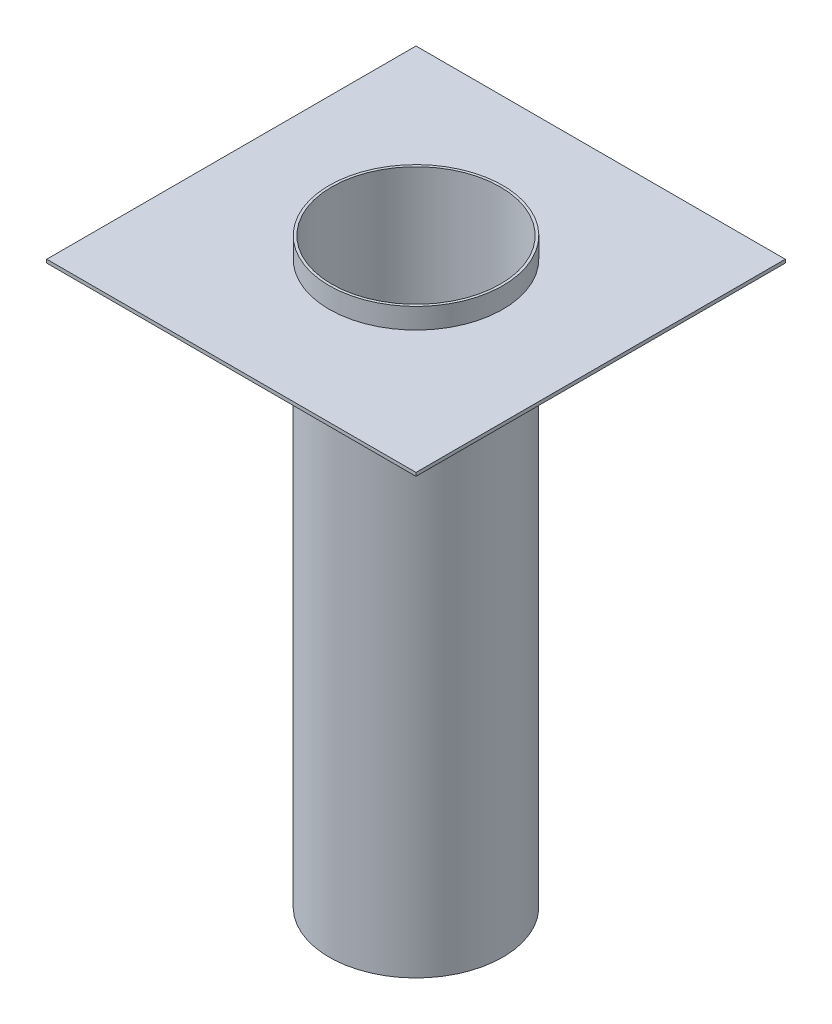
ISO-10303-21;
HEADER;
FILE_DESCRIPTION(('STEP AP214'),'2;1');
FILE_NAME('part.step','',(''),(''),'','','');
FILE_SCHEMA(('AUTOMOTIVE_DESIGN { 1 0 10303 214 1 1 1 1 }'));
ENDSEC;
DATA;
#1=APPLICATION_CONTEXT('core data for automotive mechanical design processes');
#2=APPLICATION_PROTOCOL_DEFINITION('international standard','automotive_design',2000,#1);
#3=PRODUCT_CONTEXT('',#1,'mechanical');
#4=PRODUCT('Part','Part','',(#3));
#5=PRODUCT_RELATED_PRODUCT_CATEGORY('part','',(#4));
#6=PRODUCT_DEFINITION_FORMATION('','',#4);
#7=PRODUCT_DEFINITION_CONTEXT('part definition',#1,'design');
#8=PRODUCT_DEFINITION('design','',#6,#7);
#9=PRODUCT_DEFINITION_SHAPE('','',#8);
#10=(LENGTH_UNIT() NAMED_UNIT(*) SI_UNIT(.MILLI.,.METRE.));
#11=(NAMED_UNIT(*) PLANE_ANGLE_UNIT() SI_UNIT($,.RADIAN.));
#12=(NAMED_UNIT(*) SI_UNIT($,.STERADIAN.) SOLID_ANGLE_UNIT());
#13=UNCERTAINTY_MEASURE_WITH_UNIT(LENGTH_MEASURE(1.E-05),#10,'distance_accuracy_value','');
#14=(GEOMETRIC_REPRESENTATION_CONTEXT(3) GLOBAL_UNCERTAINTY_ASSIGNED_CONTEXT((#13)) GLOBAL_UNIT_ASSIGNED_CONTEXT((#10,
#11,#12)) REPRESENTATION_CONTEXT('',''));
#15=CARTESIAN_POINT('',(0.,0.,0.));
#16=DIRECTION('',(0.,0.,1.));
#17=DIRECTION('',(1.,0.,0.));
#18=AXIS2_PLACEMENT_3D('',#15,#16,#17);
#19=CARTESIAN_POINT('',(54.,170.1,54.));
#20=DIRECTION('',(-1.,0.,0.));
#21=DIRECTION('',(0.,0.,1.));
#22=AXIS2_PLACEMENT_3D('',#19,#20,#21);
#23=PLANE('',#22);
#24=DIRECTION('',(0.,0.,1.));
#25=VECTOR('',#24,1.);
#26=CARTESIAN_POINT('',(54.,163.1,54.));
#27=LINE('',#26,#25);
#28=CARTESIAN_POINT('',(54.,163.1,-54.));
#29=VERTEX_POINT('',#28);
#30=CARTESIAN_POINT('',(54.,163.1,54.));
#31=VERTEX_POINT('',#30);
#32=EDGE_CURVE('E63',#29,#31,#27,.T.);
#33=ORIENTED_EDGE('',*,*,#32,.F.);
#34=DIRECTION('',(0.,-1.,0.));
#35=VECTOR('',#34,1.);
#36=CARTESIAN_POINT('',(54.,170.1,-54.));
#37=LINE('',#36,#35);
#38=CARTESIAN_POINT('',(54.,164.1,-54.));
#39=VERTEX_POINT('',#38);
#40=EDGE_CURVE('E107',#39,#29,#37,.T.);
#41=ORIENTED_EDGE('',*,*,#40,.F.);
#42=DIRECTION('',(0.,0.,-1.));
#43=VECTOR('',#42,1.);
#44=CARTESIAN_POINT('',(54.,164.1,54.));
#45=LINE('',#44,#43);
#46=CARTESIAN_POINT('',(54.,164.1,54.));
#47=VERTEX_POINT('',#46);
#48=EDGE_CURVE('E109',#47,#39,#45,.T.);
#49=ORIENTED_EDGE('',*,*,#48,.F.);
#50=DIRECTION('',(0.,-1.,0.));
#51=VECTOR('',#50,1.);
#52=CARTESIAN_POINT('',(54.,170.1,54.));
#53=LINE('',#52,#51);
#54=EDGE_CURVE('E105',#47,#31,#53,.T.);
#55=ORIENTED_EDGE('',*,*,#54,.T.);
#56=EDGE_LOOP('',(#33,#41,#49,#55));
#57=FACE_BOUND('',#56,.T.);
#58=ADVANCED_FACE('F50',(#57),#23,.F.);
#59=CARTESIAN_POINT('',(-54.,170.1,-54.));
#60=DIRECTION('',(0.,0.,1.));
#61=DIRECTION('',(1.,0.,0.));
#62=AXIS2_PLACEMENT_3D('',#59,#60,#61);
#63=PLANE('',#62);
#64=DIRECTION('',(1.,0.,0.));
#65=VECTOR('',#64,1.);
#66=CARTESIAN_POINT('',(-54.,163.1,-54.));
#67=LINE('',#66,#65);
#68=CARTESIAN_POINT('',(-54.,163.1,-54.));
#69=VERTEX_POINT('',#68);
#70=EDGE_CURVE('E101',#69,#29,#67,.T.);
#71=ORIENTED_EDGE('',*,*,#70,.F.);
#72=DIRECTION('',(0.,-1.,0.));
#73=VECTOR('',#72,1.);
#74=CARTESIAN_POINT('',(-54.,170.1,-54.));
#75=LINE('',#74,#73);
#76=CARTESIAN_POINT('',(-54.,164.1,-54.));
#77=VERTEX_POINT('',#76);
#78=EDGE_CURVE('E100',#77,#69,#75,.T.);
#79=ORIENTED_EDGE('',*,*,#78,.F.);
#80=DIRECTION('',(-1.,0.,0.));
#81=VECTOR('',#80,1.);
#82=CARTESIAN_POINT('',(-54.,164.1,-54.));
#83=LINE('',#82,#81);
#84=EDGE_CURVE('E119',#39,#77,#83,.T.);
#85=ORIENTED_EDGE('',*,*,#84,.F.);
#86=ORIENTED_EDGE('',*,*,#40,.T.);
#87=EDGE_LOOP('',(#71,#79,#85,#86));
#88=FACE_BOUND('',#87,.T.);
#89=ADVANCED_FACE('F168',(#88),#63,.F.);
#90=CARTESIAN_POINT('',(-54.,170.1,54.));
#91=DIRECTION('',(1.,0.,0.));
#92=DIRECTION('',(0.,0.,-1.));
#93=AXIS2_PLACEMENT_3D('',#90,#91,#92);
#94=PLANE('',#93);
#95=DIRECTION('',(0.,0.,-1.));
#96=VECTOR('',#95,1.);
#97=CARTESIAN_POINT('',(-54.,163.1,54.));
#98=LINE('',#97,#96);
#99=CARTESIAN_POINT('',(-54.,163.1,54.));
#100=VERTEX_POINT('',#99);
#101=EDGE_CURVE('E88',#100,#69,#98,.T.);
#102=ORIENTED_EDGE('',*,*,#101,.F.);
#103=DIRECTION('',(0.,-1.,0.));
#104=VECTOR('',#103,1.);
#105=CARTESIAN_POINT('',(-54.,170.1,54.));
#106=LINE('',#105,#104);
#107=CARTESIAN_POINT('',(-54.,164.1,54.));
#108=VERTEX_POINT('',#107);
#109=EDGE_CURVE('E98',#108,#100,#106,.T.);
#110=ORIENTED_EDGE('',*,*,#109,.F.);
#111=DIRECTION('',(0.,0.,1.));
#112=VECTOR('',#111,1.);
#113=CARTESIAN_POINT('',(-54.,164.1,54.));
#114=LINE('',#113,#112);
#115=EDGE_CURVE('E71',#77,#108,#114,.T.);
#116=ORIENTED_EDGE('',*,*,#115,.F.);
#117=ORIENTED_EDGE('',*,*,#78,.T.);
#118=EDGE_LOOP('',(#102,#110,#116,#117));
#119=FACE_BOUND('',#118,.T.);
#120=ADVANCED_FACE('F97',(#119),#94,.F.);
#121=CARTESIAN_POINT('',(-54.,170.1,54.));
#122=DIRECTION('',(0.,0.,-1.));
#123=DIRECTION('',(-1.,0.,0.));
#124=AXIS2_PLACEMENT_3D('',#121,#122,#123);
#125=PLANE('',#124);
#126=DIRECTION('',(-1.,0.,0.));
#127=VECTOR('',#126,1.);
#128=CARTESIAN_POINT('',(-54.,163.1,54.));
#129=LINE('',#128,#127);
#130=EDGE_CURVE('E13',#31,#100,#129,.T.);
#131=ORIENTED_EDGE('',*,*,#130,.F.);
#132=ORIENTED_EDGE('',*,*,#54,.F.);
#133=DIRECTION('',(1.,0.,0.));
#134=VECTOR('',#133,1.);
#135=CARTESIAN_POINT('',(-54.,164.1,54.));
#136=LINE('',#135,#134);
#137=EDGE_CURVE('E57',#108,#47,#136,.T.);
#138=ORIENTED_EDGE('',*,*,#137,.F.);
#139=ORIENTED_EDGE('',*,*,#109,.T.);
#140=EDGE_LOOP('',(#131,#132,#138,#139));
#141=FACE_BOUND('',#140,.T.);
#142=ADVANCED_FACE('F104',(#141),#125,.F.);
#143=CARTESIAN_POINT('',(0.,164.1,0.));
#144=DIRECTION('',(0.,1.,0.));
#145=DIRECTION('',(0.,0.,1.));
#146=AXIS2_PLACEMENT_3D('',#143,#144,#145);
#147=PLANE('',#146);
#148=CARTESIAN_POINT('',(0.,164.1,0.));
#149=DIRECTION('',(0.,1.,0.));
#150=DIRECTION('',(0.,0.,1.));
#151=AXIS2_PLACEMENT_3D('',#148,#149,#150);
#152=CIRCLE('',#151,25.4);
#153=CARTESIAN_POINT('',(0.,164.1,25.4));
#154=VERTEX_POINT('',#153);
#155=EDGE_CURVE('E123',#154,#154,#152,.T.);
#156=ORIENTED_EDGE('',*,*,#155,.F.);
#157=EDGE_LOOP('',(#156));
#158=FACE_BOUND('',#157,.T.);
#159=ORIENTED_EDGE('',*,*,#48,.T.);
#160=ORIENTED_EDGE('',*,*,#84,.T.);
#161=ORIENTED_EDGE('',*,*,#115,.T.);
#162=ORIENTED_EDGE('',*,*,#137,.T.);
#163=EDGE_LOOP('',(#159,#160,#161,#162));
#164=FACE_BOUND('',#163,.T.);
#165=ADVANCED_FACE('F115',(#158,#164),#147,.T.);
#166=CARTESIAN_POINT('',(0.,164.1,0.));
#167=DIRECTION('',(0.,1.,0.));
#168=DIRECTION('',(0.,0.,1.));
#169=AXIS2_PLACEMENT_3D('',#166,#167,#168);
#170=CYLINDRICAL_SURFACE('',#169,25.4);
#171=ORIENTED_EDGE('',*,*,#155,.T.);
#172=EDGE_LOOP('',(#171));
#173=FACE_BOUND('',#172,.T.);
#174=CARTESIAN_POINT('',(0.,170.1,0.));
#175=DIRECTION('',(0.,1.,0.));
#176=DIRECTION('',(0.,0.,1.));
#177=AXIS2_PLACEMENT_3D('',#174,#175,#176);
#178=CIRCLE('',#177,25.4);
#179=CARTESIAN_POINT('',(0.,170.1,25.4));
#180=VERTEX_POINT('',#179);
#181=EDGE_CURVE('E124',#180,#180,#178,.T.);
#182=ORIENTED_EDGE('',*,*,#181,.F.);
#183=EDGE_LOOP('',(#182));
#184=FACE_BOUND('',#183,.T.);
#185=ADVANCED_FACE('F182',(#173,#184),#170,.T.);
#186=CARTESIAN_POINT('',(0.,170.1,0.));
#187=DIRECTION('',(0.,-1.,0.));
#188=DIRECTION('',(0.,0.,-1.));
#189=AXIS2_PLACEMENT_3D('',#186,#187,#188);
#190=PLANE('',#189);
#191=CARTESIAN_POINT('',(0.,170.1,0.));
#192=DIRECTION('',(0.,-1.,0.));
#193=DIRECTION('',(0.,0.,-1.));
#194=AXIS2_PLACEMENT_3D('',#191,#192,#193);
#195=CIRCLE('',#194,24.65);
#196=CARTESIAN_POINT('',(0.,170.1,-24.65));
#197=VERTEX_POINT('',#196);
#198=EDGE_CURVE('E134',#197,#197,#195,.T.);
#199=ORIENTED_EDGE('',*,*,#198,.T.);
#200=EDGE_LOOP('',(#199));
#201=FACE_BOUND('',#200,.T.);
#202=ORIENTED_EDGE('',*,*,#181,.T.);
#203=EDGE_LOOP('',(#202));
#204=FACE_BOUND('',#203,.T.);
#205=ADVANCED_FACE('F143',(#201,#204),#190,.F.);
#206=CARTESIAN_POINT('',(0.,163.1,0.));
#207=DIRECTION('',(0.,-1.,0.));
#208=DIRECTION('',(0.,0.,-1.));
#209=AXIS2_PLACEMENT_3D('',#206,#207,#208);
#210=PLANE('',#209);
#211=CARTESIAN_POINT('',(0.,163.1,0.));
#212=DIRECTION('',(0.,-1.,0.));
#213=DIRECTION('',(0.,0.,-1.));
#214=AXIS2_PLACEMENT_3D('',#211,#212,#213);
#215=CIRCLE('',#214,25.4);
#216=CARTESIAN_POINT('',(0.,163.1,-25.4));
#217=VERTEX_POINT('',#216);
#218=EDGE_CURVE('E102',#217,#217,#215,.T.);
#219=ORIENTED_EDGE('',*,*,#218,.F.);
#220=EDGE_LOOP('',(#219));
#221=FACE_BOUND('',#220,.T.);
#222=ORIENTED_EDGE('',*,*,#32,.T.);
#223=ORIENTED_EDGE('',*,*,#130,.T.);
#224=ORIENTED_EDGE('',*,*,#101,.T.);
#225=ORIENTED_EDGE('',*,*,#70,.T.);
#226=EDGE_LOOP('',(#222,#223,#224,#225));
#227=FACE_BOUND('',#226,.T.);
#228=ADVANCED_FACE('F87',(#221,#227),#210,.T.);
#229=CARTESIAN_POINT('',(0.,163.1,0.));
#230=DIRECTION('',(0.,-1.,0.));
#231=DIRECTION('',(0.,0.,-1.));
#232=AXIS2_PLACEMENT_3D('',#229,#230,#231);
#233=CYLINDRICAL_SURFACE('',#232,25.4);
#234=ORIENTED_EDGE('',*,*,#218,.T.);
#235=EDGE_LOOP('',(#234));
#236=FACE_BOUND('',#235,.T.);
#237=CARTESIAN_POINT('',(0.,0.,0.));
#238=DIRECTION('',(0.,-1.,0.));
#239=DIRECTION('',(0.,0.,-1.));
#240=AXIS2_PLACEMENT_3D('',#237,#238,#239);
#241=CIRCLE('',#240,25.4);
#242=CARTESIAN_POINT('',(0.,0.,-25.4));
#243=VERTEX_POINT('',#242);
#244=EDGE_CURVE('E131',#243,#243,#241,.T.);
#245=ORIENTED_EDGE('',*,*,#244,.F.);
#246=EDGE_LOOP('',(#245));
#247=FACE_BOUND('',#246,.T.);
#248=ADVANCED_FACE('F155',(#236,#247),#233,.T.);
#249=CARTESIAN_POINT('',(0.,0.,0.));
#250=DIRECTION('',(0.,-1.,0.));
#251=DIRECTION('',(0.,0.,-1.));
#252=AXIS2_PLACEMENT_3D('',#249,#250,#251);
#253=PLANE('',#252);
#254=CARTESIAN_POINT('',(0.,0.,0.));
#255=DIRECTION('',(0.,-1.,0.));
#256=DIRECTION('',(0.,0.,-1.));
#257=AXIS2_PLACEMENT_3D('',#254,#255,#256);
#258=CIRCLE('',#257,24.65);
#259=CARTESIAN_POINT('',(0.,0.,-24.65));
#260=VERTEX_POINT('',#259);
#261=EDGE_CURVE('E137',#260,#260,#258,.T.);
#262=ORIENTED_EDGE('',*,*,#261,.F.);
#263=EDGE_LOOP('',(#262));
#264=FACE_BOUND('',#263,.T.);
#265=ORIENTED_EDGE('',*,*,#244,.T.);
#266=EDGE_LOOP('',(#265));
#267=FACE_BOUND('',#266,.T.);
#268=ADVANCED_FACE('F149',(#264,#267),#253,.T.);
#269=CARTESIAN_POINT('',(0.,170.1,0.));
#270=DIRECTION('',(0.,-1.,0.));
#271=DIRECTION('',(0.,0.,-1.));
#272=AXIS2_PLACEMENT_3D('',#269,#270,#271);
#273=CYLINDRICAL_SURFACE('',#272,24.65);
#274=ORIENTED_EDGE('',*,*,#198,.F.);
#275=EDGE_LOOP('',(#274));
#276=FACE_BOUND('',#275,.T.);
#277=ORIENTED_EDGE('',*,*,#261,.T.);
#278=EDGE_LOOP('',(#277));
#279=FACE_BOUND('',#278,.T.);
#280=ADVANCED_FACE('F146',(#276,#279),#273,.F.);
#281=CLOSED_SHELL('',(#58,#89,#120,#142,#165,#185,#205,#228,#248,#268,#280));
#282=MANIFOLD_SOLID_BREP('B2',#281);
#283=ADVANCED_BREP_SHAPE_REPRESENTATION('',(#18,#282),#14);
#284=SHAPE_DEFINITION_REPRESENTATION(#9,#283);
ENDSEC;
END-ISO-10303-21;
